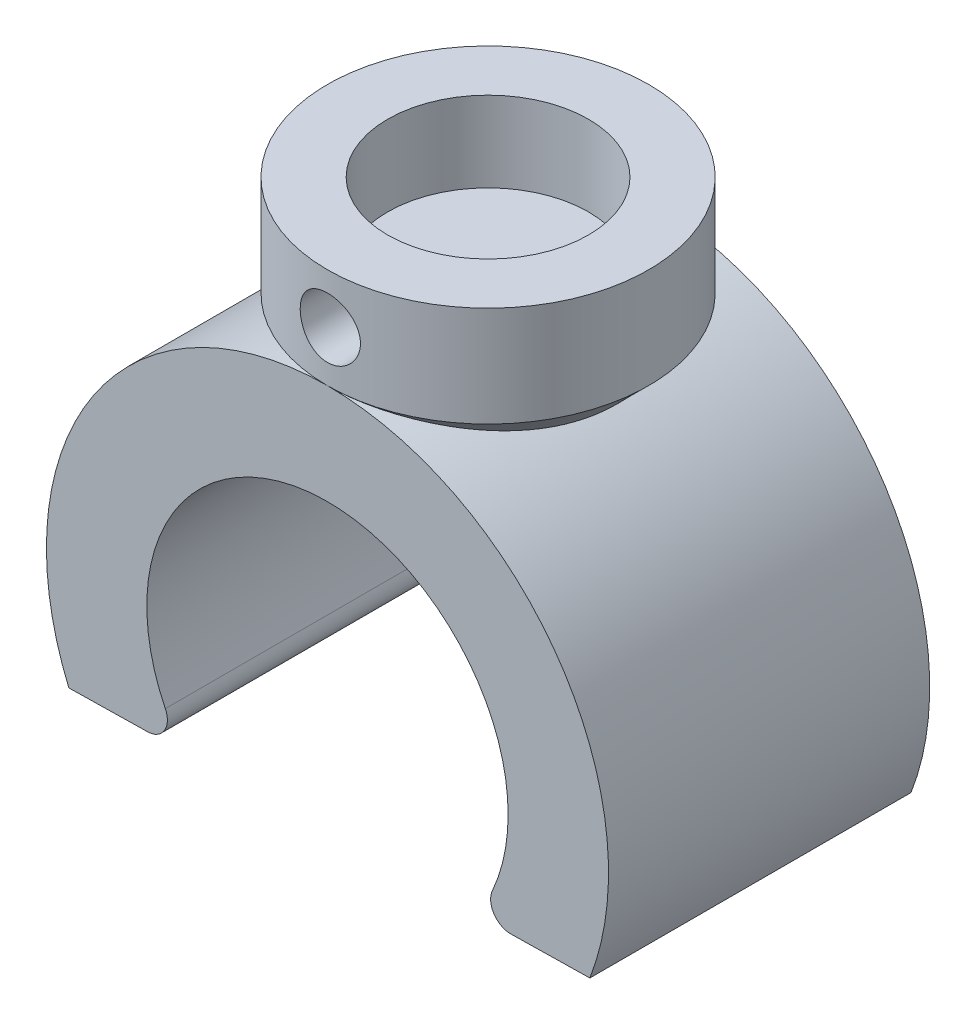
ISO-10303-21;
HEADER;
FILE_DESCRIPTION(('STEP AP214'),'2;1');
FILE_NAME('part.step','',(''),(''),'','','');
FILE_SCHEMA(('AUTOMOTIVE_DESIGN { 1 0 10303 214 1 1 1 1 }'));
ENDSEC;
DATA;
#1=APPLICATION_CONTEXT('core data for automotive mechanical design processes');
#2=APPLICATION_PROTOCOL_DEFINITION('international standard','automotive_design',2000,#1);
#3=PRODUCT_CONTEXT('',#1,'mechanical');
#4=PRODUCT('Part','Part','',(#3));
#5=PRODUCT_RELATED_PRODUCT_CATEGORY('part','',(#4));
#6=PRODUCT_DEFINITION_FORMATION('','',#4);
#7=PRODUCT_DEFINITION_CONTEXT('part definition',#1,'design');
#8=PRODUCT_DEFINITION('design','',#6,#7);
#9=PRODUCT_DEFINITION_SHAPE('','',#8);
#10=(LENGTH_UNIT() NAMED_UNIT(*) SI_UNIT(.MILLI.,.METRE.));
#11=(NAMED_UNIT(*) PLANE_ANGLE_UNIT() SI_UNIT($,.RADIAN.));
#12=(NAMED_UNIT(*) SI_UNIT($,.STERADIAN.) SOLID_ANGLE_UNIT());
#13=UNCERTAINTY_MEASURE_WITH_UNIT(LENGTH_MEASURE(1.E-05),#10,'distance_accuracy_value','');
#14=(GEOMETRIC_REPRESENTATION_CONTEXT(3) GLOBAL_UNCERTAINTY_ASSIGNED_CONTEXT((#13)) GLOBAL_UNIT_ASSIGNED_CONTEXT((#10,
#11,#12)) REPRESENTATION_CONTEXT('',''));
#15=CARTESIAN_POINT('',(0.,0.,0.));
#16=DIRECTION('',(0.,0.,1.));
#17=DIRECTION('',(1.,0.,0.));
#18=AXIS2_PLACEMENT_3D('',#15,#16,#17);
#19=CARTESIAN_POINT('',(0.,0.,16.));
#20=DIRECTION('',(0.,0.,-1.));
#21=DIRECTION('',(-1.,0.,0.));
#22=AXIS2_PLACEMENT_3D('',#19,#20,#21);
#23=CYLINDRICAL_SURFACE('',#22,14.);
#24=CARTESIAN_POINT('',(-4.7847289351422,13.1569893599263,2.67751320195993));
#25=CARTESIAN_POINT('',(-4.92259165947104,13.1068530386451,2.86886324955227));
#26=CARTESIAN_POINT('',(-5.05185351081549,13.0573980846638,3.06652576180412));
#27=CARTESIAN_POINT('',(-5.29325539066796,12.9614166811305,3.47271902235973));
#28=CARTESIAN_POINT('',(-5.40539525214689,12.9148902601498,3.68124987666014));
#29=CARTESIAN_POINT('',(-5.61269810575007,12.8261590347082,4.10790031171428));
#30=CARTESIAN_POINT('',(-5.70783230863332,12.7839616093895,4.32603538817819));
#31=CARTESIAN_POINT('',(-5.88077294083157,12.7053347397049,4.76995531401373));
#32=CARTESIAN_POINT('',(-5.95858724184352,12.6689026772325,4.99573663427666));
#33=CARTESIAN_POINT('',(-6.09736708029159,12.602701266065,5.45544004321236));
#34=CARTESIAN_POINT('',(-6.15818892320618,12.5729891224576,5.68941377863226));
#35=CARTESIAN_POINT('',(-6.26194927420481,12.5216351456844,6.16217063456431));
#36=CARTESIAN_POINT('',(-6.30488749797296,12.4999934408239,6.40095383147457));
#37=CARTESIAN_POINT('',(-6.37268141039293,12.4655677699288,6.88150607973016));
#38=CARTESIAN_POINT('',(-6.39755203790134,12.4527764865046,7.12327249584138));
#39=CARTESIAN_POINT('',(-6.42915159136247,12.4364917633029,7.60829933411208));
#40=CARTESIAN_POINT('',(-6.43588064691723,12.4329982571028,7.85155974558612));
#41=CARTESIAN_POINT('',(-6.43113677343741,12.4354528957646,8.34054689958434));
#42=CARTESIAN_POINT('',(-6.4194618296947,12.441505829153,8.58627118266443));
#43=CARTESIAN_POINT('',(-6.37759142918007,12.4630204240009,9.07572331435848));
#44=CARTESIAN_POINT('',(-6.34739556743153,12.4784822911952,9.31945111919954));
#45=CARTESIAN_POINT('',(-6.26859247386851,12.5182544105472,9.80336983012269));
#46=CARTESIAN_POINT('',(-6.21997107139643,12.5425714724668,10.0435578657714));
#47=CARTESIAN_POINT('',(-6.10450262442174,12.5991736563478,10.5185483530456));
#48=CARTESIAN_POINT('',(-6.03765565886616,12.6314587437944,10.7533508279948));
#49=CARTESIAN_POINT('',(-5.88582043078585,12.7029194396004,11.2162688904585));
#50=CARTESIAN_POINT('',(-5.80080965958057,12.7421035866103,11.4443757781761));
#51=CARTESIAN_POINT('',(-5.6128264570442,12.8260193518759,11.8920314265552));
#52=CARTESIAN_POINT('',(-5.50985253070747,12.8707514317755,12.1115794730343));
#53=CARTESIAN_POINT('',(-5.28606427850298,12.9642670558524,12.54035191995));
#54=CARTESIAN_POINT('',(-5.16526016730844,13.013048273377,12.749582140371));
#55=CARTESIAN_POINT('',(-4.90578484586551,13.1130699293151,13.1560358528358));
#56=CARTESIAN_POINT('',(-4.76711129780538,13.1643106889527,13.3532577688844));
#57=CARTESIAN_POINT('',(-4.38906223357844,13.2964567412004,13.8402938408835));
#58=CARTESIAN_POINT('',(-4.13676331072937,13.3779143774194,14.1201539320842));
#59=CARTESIAN_POINT('',(-3.58914076511522,13.5351011882582,14.6355679205869));
#60=CARTESIAN_POINT('',(-3.29388795790524,13.6108394857096,14.8711933082313));
#61=CARTESIAN_POINT('',(-2.7268814355575,13.7342658316819,15.2436358453642));
#62=CARTESIAN_POINT('',(-2.46257671406343,13.7845254982972,15.3908028130744));
#63=CARTESIAN_POINT('',(-2.04984149654366,13.8498245841676,15.5789412292753));
#64=CARTESIAN_POINT('',(-1.9095153252705,13.869912729414,15.6362282814999));
#65=CARTESIAN_POINT('',(-1.62416204825765,13.9062123468784,15.739052095421));
#66=CARTESIAN_POINT('',(-1.47913705253355,13.9224255324905,15.7845940511635));
#67=CARTESIAN_POINT('',(-1.18419058971041,13.9506203570454,15.8634177414429));
#68=CARTESIAN_POINT('',(-1.0342403227305,13.9625689606884,15.8966038440296));
#69=CARTESIAN_POINT('',(-0.731747106327781,13.9816842662799,15.9495470884855));
#70=CARTESIAN_POINT('',(-0.579205413928908,13.9888532223994,15.9693105608002));
#71=CARTESIAN_POINT('',(-0.272827292653325,13.9981802092336,15.995002084047));
#72=CARTESIAN_POINT('',(-0.118991060048384,14.0003389863029,16.000932195703));
#73=CARTESIAN_POINT('',(0.188563035163672,13.9995745803608,15.9988301113211));
#74=CARTESIAN_POINT('',(0.342280906973649,13.9966518432995,15.9907991404983));
#75=CARTESIAN_POINT('',(0.63094157274146,13.9864347390928,15.9626391791575));
#76=CARTESIAN_POINT('',(0.766048276237477,13.9796700587843,15.9439753117815));
#77=CARTESIAN_POINT('',(1.03415853597305,13.9623995756942,15.896126950546));
#78=CARTESIAN_POINT('',(1.16716138829269,13.9518925473153,15.8669390100755));
#79=CARTESIAN_POINT('',(1.56163746126822,13.9151280247317,15.7642520422674));
#80=CARTESIAN_POINT('',(1.81882107417943,13.883617814956,15.6756050800217));
#81=CARTESIAN_POINT('',(2.32626963411161,13.8078673193437,15.4584975528957));
#82=CARTESIAN_POINT('',(2.57581442934672,13.763156564469,15.3285488195565));
#83=CARTESIAN_POINT('',(3.05326482736365,13.6651767210728,15.0362322369848));
#84=CARTESIAN_POINT('',(3.28115470002602,13.6119014857997,14.8738410832643));
#85=CARTESIAN_POINT('',(3.81782825438613,13.4734460722521,14.4374103412777));
#86=CARTESIAN_POINT('',(4.11276722210828,13.385249597539,14.14724844373));
#87=CARTESIAN_POINT('',(4.65037987205212,13.2081190110496,13.5220986518884));
#88=CARTESIAN_POINT('',(4.8929630389335,13.119183893526,13.1870347238338));
#89=CARTESIAN_POINT('',(5.32893943645344,12.9482808849743,12.4776592448569));
#90=CARTESIAN_POINT('',(5.52154610802826,12.8664365114327,12.1028374095771));
#91=CARTESIAN_POINT('',(5.85254670912225,12.7193019476367,11.3269877736449));
#92=CARTESIAN_POINT('',(5.99095731860296,12.6540066662418,10.9259680803331));
#93=CARTESIAN_POINT('',(6.16566456130889,12.569385487839,10.2804109036507));
#94=CARTESIAN_POINT('',(6.22036898602124,12.5423105616657,10.0416862318104));
#95=CARTESIAN_POINT('',(6.31141804974414,12.496745205302,9.55988133997942));
#96=CARTESIAN_POINT('',(6.34776114557655,12.4782554966669,9.3168007556731));
#97=CARTESIAN_POINT('',(6.4019036464684,12.4505641242054,8.82805925855365));
#98=CARTESIAN_POINT('',(6.41970240703977,12.4413627831863,8.5823982563606));
#99=CARTESIAN_POINT('',(6.43666888003923,12.4325938247441,8.09026516040992));
#100=CARTESIAN_POINT('',(6.43583717617039,12.4330259055004,7.84379309230536));
#101=CARTESIAN_POINT('',(6.41558452543127,12.4434883252134,7.3527271266954));
#102=CARTESIAN_POINT('',(6.39623173208454,12.4534834741532,7.10812965631399));
#103=CARTESIAN_POINT('',(6.33913201530562,12.4826451392692,6.6216426624032));
#104=CARTESIAN_POINT('',(6.30138477456009,12.5018118136587,6.3797531856617));
#105=CARTESIAN_POINT('',(6.2076257039153,12.5486304348126,5.90020652315192));
#106=CARTESIAN_POINT('',(6.15160141979782,12.5762881667358,5.66255234015379));
#107=CARTESIAN_POINT('',(6.0214822657803,12.6391046238714,5.19326257433981));
#108=CARTESIAN_POINT('',(5.94738743768499,12.6742633317308,4.96162697760182));
#109=CARTESIAN_POINT('',(5.78077767505935,12.7511205073113,4.50453214847836));
#110=CARTESIAN_POINT('',(5.68815186759637,12.7928580014019,4.27911986383665));
#111=CARTESIAN_POINT('',(5.48487282880639,12.8813220075977,3.83756116157749));
#112=CARTESIAN_POINT('',(5.37421780499984,12.928049015605,3.62141566797375));
#113=CARTESIAN_POINT('',(5.13500241864705,13.0249140196015,3.20026924691086));
#114=CARTESIAN_POINT('',(5.00645623231068,13.0750492990849,2.99525967288779));
#115=CARTESIAN_POINT('',(4.73139572297959,13.1770789821902,2.59813666174687));
#116=CARTESIAN_POINT('',(4.58487981644793,13.2289735405521,2.40602436348098));
#117=CARTESIAN_POINT('',(4.19520032764785,13.3589387089485,1.94358892962938));
#118=CARTESIAN_POINT('',(3.9405735802295,13.4370047102009,1.68271465937534));
#119=CARTESIAN_POINT('',(3.39139168846223,13.5859907928709,1.20497510506509));
#120=CARTESIAN_POINT('',(3.09690253711167,13.6569223541485,0.988038532570483));
#121=CARTESIAN_POINT('',(2.53100770787274,13.7717217164918,0.646218573530171));
#122=CARTESIAN_POINT('',(2.26605496633071,13.8181708753062,0.51165533934557));
#123=CARTESIAN_POINT('',(1.85391916094008,13.8774041605359,0.342440582884959));
#124=CARTESIAN_POINT('',(1.7140545651685,13.8954115416271,0.291465805771054));
#125=CARTESIAN_POINT('',(1.43019349731651,13.9274873755641,0.201186442561462));
#126=CARTESIAN_POINT('',(1.28619884122977,13.9415575312061,0.161876811003805));
#127=CARTESIAN_POINT('',(0.994058195127138,13.965438524148,0.0954121013401816));
#128=CARTESIAN_POINT('',(0.845890901241483,13.9752202846589,0.0683399603284373));
#129=CARTESIAN_POINT('',(0.547580657929964,13.9900838799555,0.0272840982113621));
#130=CARTESIAN_POINT('',(0.39743862290042,13.9951678173765,0.0132945216235931));
#131=CARTESIAN_POINT('',(0.0964145945117172,14.0004766476435,-0.00131350007402115));
#132=CARTESIAN_POINT('',(-0.0544673658598009,14.0007017551729,-0.00193253595035952));
#133=CARTESIAN_POINT('',(-0.355574121610451,13.9962956904646,0.0101911282944102));
#134=CARTESIAN_POINT('',(-0.505798960823411,13.9916648472652,0.0229329230881699));
#135=CARTESIAN_POINT('',(-0.924014257307386,13.9720560767113,0.0770557594423606));
#136=CARTESIAN_POINT('',(-1.18998874651083,13.9517621991407,0.133199131379633));
#137=CARTESIAN_POINT('',(-1.70888414272118,13.8977716596218,0.284623240544964));
#138=CARTESIAN_POINT('',(-1.96180110849526,13.8640709774279,0.379915717541603));
#139=CARTESIAN_POINT('',(-2.46465697068392,13.783834658354,0.611297915225636));
#140=CARTESIAN_POINT('',(-2.71352348482636,13.7366547044465,0.749477532676426));
#141=CARTESIAN_POINT('',(-3.18849644047476,13.6342451867693,1.05789324281703));
#142=CARTESIAN_POINT('',(-3.41459825343029,13.5790139915755,1.22813583447774));
#143=CARTESIAN_POINT('',(-3.84643666825482,13.4631269621085,1.59827696300887));
#144=CARTESIAN_POINT('',(-4.05175244545106,13.4023937075272,1.7986383007686));
#145=CARTESIAN_POINT('',(-4.43719327525351,13.2797688850922,2.22205875696331));
#146=CARTESIAN_POINT('',(-4.61730361438475,13.2178766644022,2.44513100255782));
#147=CARTESIAN_POINT('',(-4.7847289351422,13.1569893599263,2.67751320195993));
#148=B_SPLINE_CURVE_WITH_KNOTS('',3,(#24,#25,#26,#27,#28,#29,#30,#31,#32,#33,#34,#35,#36,#37,
#38,#39,#40,#41,#42,#43,#44,#45,#46,#47,#48,#49,#50,#51,#52,#53,#54,#55,#56,#57,#58,#59,#60,#61,
#62,#63,#64,#65,#66,#67,#68,#69,#70,#71,#72,#73,#74,#75,#76,#77,#78,#79,#80,#81,#82,#83,#84,#85,
#86,#87,#88,#89,#90,#91,#92,#93,#94,#95,#96,#97,#98,#99,#100,#101,#102,#103,#104,#105,#106,#107,
#108,#109,#110,#111,#112,#113,#114,#115,#116,#117,#118,#119,#120,#121,#122,#123,#124,#125,#126,
#127,#128,#129,#130,#131,#132,#133,#134,#135,#136,#137,#138,#139,#140,#141,#142,#143,#144,#145,
#146,#147),.UNSPECIFIED.,.T.,.F.,(4,2,2,2,2,2,2,2,2,2,2,2,2,2,2,2,2,2,2,2,2,2,2,2,2,2,2,2,2,2,2,
2,2,2,2,2,2,2,2,2,2,2,2,2,2,2,2,2,2,2,2,2,2,2,2,2,2,2,2,2,2,4),(0.,0.723035728560901,
1.44607851005655,2.17033398666743,2.8942596222678,3.62413352640823,4.35401903372796,
5.08330035975454,5.81257647583574,6.54991352292005,7.28726669312072,8.0251880992677,
8.76310630903703,9.50194430996828,10.2408438309624,10.9793216776872,11.7178962358143,
12.8698244518007,14.0198746317432,14.9358423064989,15.3940406323883,15.8520359799573,
16.3135058602777,16.7747579485349,17.2359413207436,17.6970842218647,18.1062671724231,
18.5155842514072,19.3334943500312,20.1850601062277,21.0372397847446,22.2995014425366,
23.5639281845574,24.8471898003567,26.1300561547725,26.8685155022146,27.6070369031622,
28.3455839697555,29.0841078972801,29.8199246271926,30.5557540507589,31.2920859291629,
32.0284161041387,32.7692911854457,33.5102399701604,34.2506049654113,34.991035250428,
36.1050751193326,37.2172927296661,38.1156076021316,38.5649780059257,39.0141537617382,
39.4663296781482,39.918303113068,40.3702565778675,40.8221794203649,41.6359520101452,
42.4499688068684,43.3124146278064,44.1750354498007,45.0526052048271,45.9306851162951),.UNSPECIFIED.);
#149=CARTESIAN_POINT('',(0.,14.,16.));
#150=VERTEX_POINT('',#149);
#151=CARTESIAN_POINT('',(0.,14.,0.));
#152=VERTEX_POINT('',#151);
#153=EDGE_CURVE('E122',#150,#152,#148,.T.);
#154=ORIENTED_EDGE('',*,*,#153,.F.);
#155=CARTESIAN_POINT('',(0.,0.,16.));
#156=DIRECTION('',(0.,0.,1.));
#157=DIRECTION('',(1.,0.,0.));
#158=AXIS2_PLACEMENT_3D('',#155,#156,#157);
#159=CIRCLE('',#158,14.);
#160=CARTESIAN_POINT('',(13.0703371486462,-5.0166011223456,16.));
#161=VERTEX_POINT('',#160);
#162=EDGE_CURVE('E415',#161,#150,#159,.T.);
#163=ORIENTED_EDGE('',*,*,#162,.F.);
#164=DIRECTION('',(0.,0.,-1.));
#165=VECTOR('',#164,1.);
#166=CARTESIAN_POINT('',(13.0703371486462,-5.0166011223456,16.));
#167=LINE('',#166,#165);
#168=CARTESIAN_POINT('',(13.0703371486462,-5.0166011223456,0.));
#169=VERTEX_POINT('',#168);
#170=EDGE_CURVE('E134',#161,#169,#167,.T.);
#171=ORIENTED_EDGE('',*,*,#170,.T.);
#172=CARTESIAN_POINT('',(0.,0.,0.));
#173=DIRECTION('',(0.,0.,1.));
#174=DIRECTION('',(1.,0.,0.));
#175=AXIS2_PLACEMENT_3D('',#172,#173,#174);
#176=CIRCLE('',#175,14.);
#177=EDGE_CURVE('E132',#169,#152,#176,.T.);
#178=ORIENTED_EDGE('',*,*,#177,.T.);
#179=EDGE_LOOP('',(#154,#163,#171,#178));
#180=FACE_BOUND('',#179,.T.);
#181=ADVANCED_FACE('F45',(#180),#23,.T.);
#182=EDGE_CURVE('E112',#152,#150,#148,.T.);
#183=ORIENTED_EDGE('',*,*,#182,.F.);
#184=CARTESIAN_POINT('',(-12.8828969191276,-5.48005173069871,0.));
#185=VERTEX_POINT('',#184);
#186=EDGE_CURVE('E137',#152,#185,#176,.T.);
#187=ORIENTED_EDGE('',*,*,#186,.T.);
#188=DIRECTION('',(0.,0.,-1.));
#189=VECTOR('',#188,1.);
#190=CARTESIAN_POINT('',(-12.8828969191276,-5.48005173069871,16.));
#191=LINE('',#190,#189);
#192=CARTESIAN_POINT('',(-12.8828969191276,-5.48005173069871,16.));
#193=VERTEX_POINT('',#192);
#194=EDGE_CURVE('E408',#185,#193,#191,.F.);
#195=ORIENTED_EDGE('',*,*,#194,.T.);
#196=EDGE_CURVE('E136',#150,#193,#159,.T.);
#197=ORIENTED_EDGE('',*,*,#196,.F.);
#198=EDGE_LOOP('',(#183,#187,#195,#197));
#199=FACE_BOUND('',#198,.T.);
#200=ADVANCED_FACE('F148',(#199),#23,.T.);
#201=CARTESIAN_POINT('',(0.,0.,16.));
#202=DIRECTION('',(0.,0.,1.));
#203=DIRECTION('',(1.,0.,0.));
#204=AXIS2_PLACEMENT_3D('',#201,#202,#203);
#205=PLANE('',#204);
#206=CARTESIAN_POINT('',(0.,0.,16.));
#207=DIRECTION('',(0.,0.,1.));
#208=DIRECTION('',(1.,0.,0.));
#209=AXIS2_PLACEMENT_3D('',#206,#207,#208);
#210=CIRCLE('',#209,9.);
#211=CARTESIAN_POINT('',(8.21407430972492,-3.6781766181516,16.));
#212=VERTEX_POINT('',#211);
#213=CARTESIAN_POINT('',(-8.07751583670852,-3.96909787076648,16.));
#214=VERTEX_POINT('',#213);
#215=EDGE_CURVE('E400',#212,#214,#210,.T.);
#216=ORIENTED_EDGE('',*,*,#215,.F.);
#217=CARTESIAN_POINT('',(9.12674923302768,-4.08686290905733,16.));
#218=DIRECTION('',(0.,0.,1.));
#219=DIRECTION('',(1.,0.,0.));
#220=AXIS2_PLACEMENT_3D('',#217,#218,#219);
#221=CIRCLE('',#220,1.);
#222=CARTESIAN_POINT('',(9.14460352944456,-5.08670350840278,16.));
#223=VERTEX_POINT('',#222);
#224=EDGE_CURVE('E381',#212,#223,#221,.T.);
#225=ORIENTED_EDGE('',*,*,#224,.T.);
#226=DIRECTION('',(-0.999840599345445,-0.0178542964168829,0.));
#227=VECTOR('',#226,1.);
#228=CARTESIAN_POINT('',(-14.,-5.5,16.));
#229=LINE('',#228,#227);
#230=EDGE_CURVE('E403',#161,#223,#229,.T.);
#231=ORIENTED_EDGE('',*,*,#230,.F.);
#232=ORIENTED_EDGE('',*,*,#162,.T.);
#233=ORIENTED_EDGE('',*,*,#196,.T.);
#234=CARTESIAN_POINT('',(-8.95716329992592,-5.40994934464153,16.));
#235=VERTEX_POINT('',#234);
#236=EDGE_CURVE('E128',#235,#193,#229,.T.);
#237=ORIENTED_EDGE('',*,*,#236,.F.);
#238=CARTESIAN_POINT('',(-8.9750175963428,-4.41010874529609,16.));
#239=DIRECTION('',(0.,0.,1.));
#240=DIRECTION('',(1.,0.,0.));
#241=AXIS2_PLACEMENT_3D('',#238,#239,#240);
#242=CIRCLE('',#241,1.);
#243=EDGE_CURVE('E374',#235,#214,#242,.T.);
#244=ORIENTED_EDGE('',*,*,#243,.T.);
#245=EDGE_LOOP('',(#216,#225,#231,#232,#233,#237,#244));
#246=FACE_BOUND('',#245,.T.);
#247=ADVANCED_FACE('F178',(#246),#205,.T.);
#248=CARTESIAN_POINT('',(0.,0.,0.));
#249=DIRECTION('',(0.,0.,1.));
#250=DIRECTION('',(1.,0.,0.));
#251=AXIS2_PLACEMENT_3D('',#248,#249,#250);
#252=PLANE('',#251);
#253=DIRECTION('',(-0.999840599345445,-0.0178542964168829,0.));
#254=VECTOR('',#253,1.);
#255=CARTESIAN_POINT('',(-14.,-5.5,0.));
#256=LINE('',#255,#254);
#257=CARTESIAN_POINT('',(9.14460352944456,-5.08670350840278,0.));
#258=VERTEX_POINT('',#257);
#259=EDGE_CURVE('E397',#169,#258,#256,.T.);
#260=ORIENTED_EDGE('',*,*,#259,.T.);
#261=CARTESIAN_POINT('',(9.12674923302768,-4.08686290905733,0.));
#262=DIRECTION('',(0.,0.,1.));
#263=DIRECTION('',(1.,0.,0.));
#264=AXIS2_PLACEMENT_3D('',#261,#262,#263);
#265=CIRCLE('',#264,1.);
#266=CARTESIAN_POINT('',(8.21407430972492,-3.6781766181516,0.));
#267=VERTEX_POINT('',#266);
#268=EDGE_CURVE('E54',#258,#267,#265,.F.);
#269=ORIENTED_EDGE('',*,*,#268,.T.);
#270=CARTESIAN_POINT('',(0.,0.,0.));
#271=DIRECTION('',(0.,0.,1.));
#272=DIRECTION('',(1.,0.,0.));
#273=AXIS2_PLACEMENT_3D('',#270,#271,#272);
#274=CIRCLE('',#273,9.);
#275=CARTESIAN_POINT('',(-8.07751583670852,-3.96909787076648,0.));
#276=VERTEX_POINT('',#275);
#277=EDGE_CURVE('E146',#276,#267,#274,.F.);
#278=ORIENTED_EDGE('',*,*,#277,.F.);
#279=CARTESIAN_POINT('',(-8.9750175963428,-4.41010874529609,0.));
#280=DIRECTION('',(0.,0.,1.));
#281=DIRECTION('',(1.,0.,0.));
#282=AXIS2_PLACEMENT_3D('',#279,#280,#281);
#283=CIRCLE('',#282,1.);
#284=CARTESIAN_POINT('',(-8.95716329992592,-5.40994934464153,0.));
#285=VERTEX_POINT('',#284);
#286=EDGE_CURVE('E61',#276,#285,#283,.F.);
#287=ORIENTED_EDGE('',*,*,#286,.T.);
#288=EDGE_CURVE('E141',#285,#185,#256,.T.);
#289=ORIENTED_EDGE('',*,*,#288,.T.);
#290=ORIENTED_EDGE('',*,*,#186,.F.);
#291=ORIENTED_EDGE('',*,*,#177,.F.);
#292=EDGE_LOOP('',(#260,#269,#278,#287,#289,#290,#291));
#293=FACE_BOUND('',#292,.T.);
#294=ADVANCED_FACE('F140',(#293),#252,.F.);
#295=CARTESIAN_POINT('',(0.,0.,-0.001000000000001));
#296=DIRECTION('',(0.,0.,1.));
#297=DIRECTION('',(1.,0.,0.));
#298=AXIS2_PLACEMENT_3D('',#295,#296,#297);
#299=CYLINDRICAL_SURFACE('',#298,9.);
#300=ORIENTED_EDGE('',*,*,#277,.T.);
#301=DIRECTION('',(0.,0.,1.));
#302=VECTOR('',#301,1.);
#303=CARTESIAN_POINT('',(8.21407430972492,-3.6781766181516,-0.001000000000001));
#304=LINE('',#303,#302);
#305=EDGE_CURVE('E382',#267,#212,#304,.T.);
#306=ORIENTED_EDGE('',*,*,#305,.T.);
#307=ORIENTED_EDGE('',*,*,#215,.T.);
#308=DIRECTION('',(0.,0.,1.));
#309=VECTOR('',#308,1.);
#310=CARTESIAN_POINT('',(-8.07751583670852,-3.96909787076648,-0.001000000000001));
#311=LINE('',#310,#309);
#312=EDGE_CURVE('E376',#214,#276,#311,.F.);
#313=ORIENTED_EDGE('',*,*,#312,.T.);
#314=EDGE_LOOP('',(#300,#306,#307,#313));
#315=FACE_BOUND('',#314,.T.);
#316=ADVANCED_FACE('F174',(#315),#299,.F.);
#317=CARTESIAN_POINT('',(-14.,-5.5,0.));
#318=DIRECTION('',(-0.0178542964168829,0.999840599345445,0.));
#319=DIRECTION('',(-0.999840599345445,-0.0178542964168829,0.));
#320=AXIS2_PLACEMENT_3D('',#317,#318,#319);
#321=PLANE('',#320);
#322=ORIENTED_EDGE('',*,*,#230,.T.);
#323=DIRECTION('',(0.,0.,1.));
#324=VECTOR('',#323,1.);
#325=CARTESIAN_POINT('',(9.14460352944457,-5.08670350840277,0.));
#326=LINE('',#325,#324);
#327=EDGE_CURVE('E69',#223,#258,#326,.F.);
#328=ORIENTED_EDGE('',*,*,#327,.T.);
#329=ORIENTED_EDGE('',*,*,#259,.F.);
#330=ORIENTED_EDGE('',*,*,#170,.F.);
#331=EDGE_LOOP('',(#322,#328,#329,#330));
#332=FACE_BOUND('',#331,.T.);
#333=ADVANCED_FACE('F171',(#332),#321,.F.);
#334=ORIENTED_EDGE('',*,*,#288,.F.);
#335=DIRECTION('',(0.,0.,1.));
#336=VECTOR('',#335,1.);
#337=CARTESIAN_POINT('',(-8.95716329992592,-5.40994934464153,0.));
#338=LINE('',#337,#336);
#339=EDGE_CURVE('E11',#285,#235,#338,.T.);
#340=ORIENTED_EDGE('',*,*,#339,.T.);
#341=ORIENTED_EDGE('',*,*,#236,.T.);
#342=ORIENTED_EDGE('',*,*,#194,.F.);
#343=EDGE_LOOP('',(#334,#340,#341,#342));
#344=FACE_BOUND('',#343,.T.);
#345=ADVANCED_FACE('F168',(#344),#321,.F.);
#346=CARTESIAN_POINT('',(0.,11.,8.));
#347=DIRECTION('',(0.,1.,0.));
#348=DIRECTION('',(0.,0.,1.));
#349=AXIS2_PLACEMENT_3D('',#346,#347,#348);
#350=CONICAL_SURFACE('',#349,5.,0.78539816339745);
#351=CARTESIAN_POINT('',(0.,14.,8.));
#352=DIRECTION('',(0.,1.,0.));
#353=DIRECTION('',(0.,0.,1.));
#354=AXIS2_PLACEMENT_3D('',#351,#352,#353);
#355=CIRCLE('',#354,8.00000000000001);
#356=EDGE_CURVE('E117',#150,#152,#355,.T.);
#357=ORIENTED_EDGE('',*,*,#356,.F.);
#358=ORIENTED_EDGE('',*,*,#153,.T.);
#359=EDGE_LOOP('',(#357,#358));
#360=FACE_BOUND('',#359,.T.);
#361=ADVANCED_FACE('F124',(#360),#350,.T.);
#362=EDGE_CURVE('E108',#152,#150,#355,.T.);
#363=ORIENTED_EDGE('',*,*,#362,.F.);
#364=ORIENTED_EDGE('',*,*,#182,.T.);
#365=EDGE_LOOP('',(#363,#364));
#366=FACE_BOUND('',#365,.T.);
#367=ADVANCED_FACE('F110',(#366),#350,.T.);
#368=CARTESIAN_POINT('',(0.,19.,8.));
#369=DIRECTION('',(0.,-1.,0.));
#370=DIRECTION('',(0.,0.,-1.));
#371=AXIS2_PLACEMENT_3D('',#368,#369,#370);
#372=CYLINDRICAL_SURFACE('',#371,8.);
#373=CARTESIAN_POINT('',(1.5,16.5,15.8581168227509));
#374=CARTESIAN_POINT('',(1.49999679883246,16.4165427919883,15.8581184379349));
#375=CARTESIAN_POINT('',(1.49301126348936,16.3330440517816,15.8594607976027));
#376=CARTESIAN_POINT('',(1.46527253251805,16.1684010384181,15.8646785101436));
#377=CARTESIAN_POINT('',(1.44450765768477,16.0872588235725,15.8685560117321));
#378=CARTESIAN_POINT('',(1.38987035617788,15.9297349286291,15.8783897646488));
#379=CARTESIAN_POINT('',(1.35601013954374,15.8533488906927,15.88434407906));
#380=CARTESIAN_POINT('',(1.27617565760366,15.7073464407132,15.8976582632096));
#381=CARTESIAN_POINT('',(1.23020233759193,15.6377295009967,15.9050180232562));
#382=CARTESIAN_POINT('',(1.12683678942622,15.5063698008009,15.9204161483894));
#383=CARTESIAN_POINT('',(1.06932292933092,15.4447235165283,15.9284611662568));
#384=CARTESIAN_POINT('',(0.944771778803553,15.3318956104004,15.9442645766403));
#385=CARTESIAN_POINT('',(0.877733863624947,15.2807146755752,15.9520229503115));
#386=CARTESIAN_POINT('',(0.735403894570165,15.1899006233995,15.9664501782841));
#387=CARTESIAN_POINT('',(0.660052840033867,15.1503584664806,15.9731102805236));
#388=CARTESIAN_POINT('',(0.503631283250763,15.0845304577265,15.9845160863293));
#389=CARTESIAN_POINT('',(0.422561251859507,15.0582435160098,15.9892619472833));
#390=CARTESIAN_POINT('',(0.258002746187417,15.0199704513889,15.9962575512378));
#391=CARTESIAN_POINT('',(0.174553323244858,15.0078216940773,15.9985356597633));
#392=CARTESIAN_POINT('',(0.00677167603538375,14.9976631122996,16.0004368461559));
#393=CARTESIAN_POINT('',(-0.0775604724476695,14.9996520838609,16.000060150107));
#394=CARTESIAN_POINT('',(-0.243598357899396,15.0175877711472,15.9967163376324));
#395=CARTESIAN_POINT('',(-0.325323760451468,15.03335936943,15.9937817224721));
#396=CARTESIAN_POINT('',(-0.484947165715475,15.0781356493952,15.9856882633356));
#397=CARTESIAN_POINT('',(-0.56284502882654,15.1071408133458,15.9805293382997));
#398=CARTESIAN_POINT('',(-0.713110065751521,15.1777277310583,15.9685126029734));
#399=CARTESIAN_POINT('',(-0.785443571838532,15.2193794879125,15.9616453759083));
#400=CARTESIAN_POINT('',(-0.922159977214637,15.3140256690772,15.9469714754285));
#401=CARTESIAN_POINT('',(-0.986542066910784,15.3670212468876,15.9391647065116));
#402=CARTESIAN_POINT('',(-1.10656561896904,15.4838157029835,15.9233351368057));
#403=CARTESIAN_POINT('',(-1.16205790757041,15.5477677839021,15.9153108590162));
#404=CARTESIAN_POINT('',(-1.2615517185126,15.6841495312786,15.9000650892462));
#405=CARTESIAN_POINT('',(-1.30555307271182,15.7565793217646,15.8928436090135));
#406=CARTESIAN_POINT('',(-1.38085852224478,15.9080582707027,15.8800189330712));
#407=CARTESIAN_POINT('',(-1.41214093645421,15.9871184571906,15.8744185053026));
#408=CARTESIAN_POINT('',(-1.46093656975056,16.1495011841232,15.8655124239669));
#409=CARTESIAN_POINT('',(-1.47845134901108,16.2328232404648,15.8622065103862));
#410=CARTESIAN_POINT('',(-1.49899672649739,16.4000193288559,15.8583152030101));
#411=CARTESIAN_POINT('',(-1.50224164285859,16.4838661155655,15.8576895581614));
#412=CARTESIAN_POINT('',(-1.49472968881725,16.6509034550871,15.8591219142084));
#413=CARTESIAN_POINT('',(-1.48397351086433,16.7340940401481,15.8611797823861));
#414=CARTESIAN_POINT('',(-1.44894868195883,16.8967529030544,15.8677098006321));
#415=CARTESIAN_POINT('',(-1.4247923858399,16.9762462526249,15.8721618669088));
#416=CARTESIAN_POINT('',(-1.3637722437906,17.1300571897302,15.8829613415662));
#417=CARTESIAN_POINT('',(-1.32690746128795,17.2043743953153,15.8893088896328));
#418=CARTESIAN_POINT('',(-1.2410235311966,17.3466676190432,15.9032757786369));
#419=CARTESIAN_POINT('',(-1.19186899639621,17.4145605378661,15.9109089542532));
#420=CARTESIAN_POINT('',(-1.08298344344247,17.5412120402143,15.926548113681));
#421=CARTESIAN_POINT('',(-1.02325147433084,17.5999698015558,15.9345541309649));
#422=CARTESIAN_POINT('',(-0.893949417870387,17.7074837635341,15.9501662400595));
#423=CARTESIAN_POINT('',(-0.824258534095891,17.756095826606,15.957765558333));
#424=CARTESIAN_POINT('',(-0.677574523040141,17.8409212061777,15.9715940481035));
#425=CARTESIAN_POINT('',(-0.60058167703853,17.877135000025,15.9778232723472));
#426=CARTESIAN_POINT('',(-0.441877541578686,17.9359200978641,15.9881805799585));
#427=CARTESIAN_POINT('',(-0.360193213078989,17.9585621875614,15.9923195473014));
#428=CARTESIAN_POINT('',(-0.194096227381572,17.9897870482899,15.9980764208375));
#429=CARTESIAN_POINT('',(-0.109683858215852,17.9983712986627,15.9996945922993));
#430=CARTESIAN_POINT('',(0.0580907602505088,18.0011853015184,16.0002222751544));
#431=CARTESIAN_POINT('',(0.141449307066268,17.9956327531295,15.9991728662503));
#432=CARTESIAN_POINT('',(0.306023369279199,17.9708075722316,15.994568666117));
#433=CARTESIAN_POINT('',(0.387238905213689,17.9515350712558,15.9910138989067));
#434=CARTESIAN_POINT('',(0.545106475595484,17.8999087926163,15.9817983797805));
#435=CARTESIAN_POINT('',(0.621766319318223,17.867578187119,15.9761413598158));
#436=CARTESIAN_POINT('',(0.768605631316694,17.7907795463448,15.9633337206877));
#437=CARTESIAN_POINT('',(0.838784665003271,17.7463106978933,15.9561830014648));
#438=CARTESIAN_POINT('',(0.971755027780005,17.6457485455577,15.9410477985994));
#439=CARTESIAN_POINT('',(1.03442623539053,17.5894979661383,15.9330528459127));
#440=CARTESIAN_POINT('',(1.14951536065485,17.4672954375073,15.9171963353883));
#441=CARTESIAN_POINT('',(1.2019308632478,17.4013412096263,15.9093348093676));
#442=CARTESIAN_POINT('',(1.29547633945385,17.2608735452967,15.8945557742593));
#443=CARTESIAN_POINT('',(1.33649740531872,17.1862865603324,15.8876476728073));
#444=CARTESIAN_POINT('',(1.40536132423417,17.0311742100203,15.8756708465003));
#445=CARTESIAN_POINT('',(1.43321661638912,16.9506545334106,15.8706003864912));
#446=CARTESIAN_POINT('',(1.46929726596175,16.8082477119341,15.8639301629212));
#447=CARTESIAN_POINT('',(1.48079105739851,16.7471942762381,15.8617631071793));
#448=CARTESIAN_POINT('',(1.49614351076215,16.6241015315797,15.858855855955));
#449=CARTESIAN_POINT('',(1.50000238052127,16.5620622494997,15.8581156216328));
#450=CARTESIAN_POINT('',(1.5,16.5,15.8581168227509));
#451=B_SPLINE_CURVE_WITH_KNOTS('',3,(#373,#374,#375,#376,#377,#378,#379,#380,#381,#382,#383,
#384,#385,#386,#387,#388,#389,#390,#391,#392,#393,#394,#395,#396,#397,#398,#399,#400,#401,#402,
#403,#404,#405,#406,#407,#408,#409,#410,#411,#412,#413,#414,#415,#416,#417,#418,#419,#420,#421,
#422,#423,#424,#425,#426,#427,#428,#429,#430,#431,#432,#433,#434,#435,#436,#437,#438,#439,#440,
#441,#442,#443,#444,#445,#446,#447,#448,#449,#450),.UNSPECIFIED.,.T.,.F.,(4,2,2,2,2,2,2,2,2,2,2,
2,2,2,2,2,2,2,2,2,2,2,2,2,2,2,2,2,2,2,2,2,2,2,2,2,2,2,4),(0.,0.250144505793185,
0.500501302380392,0.75062522797843,1.00072963993908,1.25362335698691,1.50653367069315,
1.76137104348047,2.0161874593964,2.26804275460261,2.51987660200648,2.76855650598725,
3.01724547328425,3.26733691984219,3.51745380911785,3.77140614764064,4.025362201924,
4.27974936118266,4.53410768866488,4.78463248587076,5.03514489338718,5.28358792315369,
5.53204926624318,5.78337862654144,6.03473059394677,6.28944125495871,6.54414210821705,
6.79750269418683,7.05083661667331,7.30029300570138,7.54974700322168,7.79876026530358,
8.0477902135711,8.30038464008745,8.55303847730765,8.80803001818118,9.0627801574912,
9.24880307527215,9.43482092920426),.UNSPECIFIED.);
#452=CARTESIAN_POINT('',(1.5,16.5,15.8581168227509));
#453=VERTEX_POINT('',#452);
#454=EDGE_CURVE('E340',#453,#453,#451,.T.);
#455=ORIENTED_EDGE('',*,*,#454,.T.);
#456=EDGE_LOOP('',(#455));
#457=FACE_BOUND('',#456,.T.);
#458=CARTESIAN_POINT('',(0.,19.,8.));
#459=DIRECTION('',(0.,1.,0.));
#460=DIRECTION('',(0.,0.,1.));
#461=AXIS2_PLACEMENT_3D('',#458,#459,#460);
#462=CIRCLE('',#461,8.);
#463=CARTESIAN_POINT('',(0.,19.,16.));
#464=VERTEX_POINT('',#463);
#465=EDGE_CURVE('E118',#464,#464,#462,.T.);
#466=ORIENTED_EDGE('',*,*,#465,.F.);
#467=EDGE_LOOP('',(#466));
#468=FACE_BOUND('',#467,.T.);
#469=ORIENTED_EDGE('',*,*,#356,.T.);
#470=ORIENTED_EDGE('',*,*,#362,.T.);
#471=EDGE_LOOP('',(#469,#470));
#472=FACE_BOUND('',#471,.T.);
#473=ADVANCED_FACE('F151',(#457,#468,#472),#372,.T.);
#474=CARTESIAN_POINT('',(0.,19.,8.));
#475=DIRECTION('',(0.,1.,0.));
#476=DIRECTION('',(0.,0.,1.));
#477=AXIS2_PLACEMENT_3D('',#474,#475,#476);
#478=PLANE('',#477);
#479=CARTESIAN_POINT('',(0.,19.,8.));
#480=DIRECTION('',(0.,1.,0.));
#481=DIRECTION('',(0.,0.,1.));
#482=AXIS2_PLACEMENT_3D('',#479,#480,#481);
#483=CIRCLE('',#482,5.);
#484=CARTESIAN_POINT('',(0.,19.,13.));
#485=VERTEX_POINT('',#484);
#486=EDGE_CURVE('E348',#485,#485,#483,.T.);
#487=ORIENTED_EDGE('',*,*,#486,.F.);
#488=EDGE_LOOP('',(#487));
#489=FACE_BOUND('',#488,.T.);
#490=ORIENTED_EDGE('',*,*,#465,.T.);
#491=EDGE_LOOP('',(#490));
#492=FACE_BOUND('',#491,.T.);
#493=ADVANCED_FACE('F277',(#489,#492),#478,.T.);
#494=CARTESIAN_POINT('',(0.,15.,8.));
#495=DIRECTION('',(0.,1.,0.));
#496=DIRECTION('',(0.,0.,1.));
#497=AXIS2_PLACEMENT_3D('',#494,#495,#496);
#498=CYLINDRICAL_SURFACE('',#497,5.);
#499=CARTESIAN_POINT('',(0.,15.,8.));
#500=DIRECTION('',(0.,1.,0.));
#501=DIRECTION('',(0.,0.,1.));
#502=AXIS2_PLACEMENT_3D('',#499,#500,#501);
#503=CIRCLE('',#502,5.);
#504=CARTESIAN_POINT('',(0.,15.,13.));
#505=VERTEX_POINT('',#504);
#506=EDGE_CURVE('E345',#505,#505,#503,.T.);
#507=ORIENTED_EDGE('',*,*,#506,.F.);
#508=CARTESIAN_POINT('',(0.,15.,13.));
#509=CARTESIAN_POINT('',(0.0822886127533,15.0000009974849,12.9999992925055));
#510=CARTESIAN_POINT('',(0.16458731835153,15.006793863624,12.9979491569395));
#511=CARTESIAN_POINT('',(0.326788125304881,15.0337213542221,12.9899710559369));
#512=CARTESIAN_POINT('',(0.40668950441142,15.0538599580233,12.9840419338969));
#513=CARTESIAN_POINT('',(0.561732707754527,15.1067460169103,12.9689555250184));
#514=CARTESIAN_POINT('',(0.636881364395373,15.1394748696189,12.9598030025043));
#515=CARTESIAN_POINT('',(0.780624181053132,15.2165360930558,12.9392210923765));
#516=CARTESIAN_POINT('',(0.84921746746967,15.2608700073954,12.9277914019207));
#517=CARTESIAN_POINT('',(0.979871797183746,15.3612240074727,12.9035073719277));
#518=CARTESIAN_POINT('',(1.04171807124434,15.4175166258859,12.8906238365704));
#519=CARTESIAN_POINT('',(1.15524920923324,15.5396092299102,12.8650583421044));
#520=CARTESIAN_POINT('',(1.20693236327441,15.605410812125,12.852376417245));
#521=CARTESIAN_POINT('',(1.29980037723708,15.7464707530376,12.8283411399377));
#522=CARTESIAN_POINT('',(1.34072309022214,15.8219084609907,12.8170240666387));
#523=CARTESIAN_POINT('',(1.4092139477476,15.9789892542303,12.7974362039403));
#524=CARTESIAN_POINT('',(1.43678529919973,16.060630843928,12.7891646831331));
#525=CARTESIAN_POINT('',(1.47701633682652,16.2253902661305,12.7769087083843));
#526=CARTESIAN_POINT('',(1.49007196234677,16.3084027438639,12.7728106932453));
#527=CARTESIAN_POINT('',(1.50213730614672,16.4755331562168,12.7690278974977));
#528=CARTESIAN_POINT('',(1.50115042761078,16.5596508180591,12.7693420476057));
#529=CARTESIAN_POINT('',(1.48546977199812,16.7233839086085,12.7742474406778));
#530=CARTESIAN_POINT('',(1.47127205262685,16.8030522503622,12.7786838859914));
#531=CARTESIAN_POINT('',(1.43037420427056,16.9588197862735,12.7910835622862));
#532=CARTESIAN_POINT('',(1.40367284141641,17.0349186273743,12.7990471413235));
#533=CARTESIAN_POINT('',(1.33816026653681,17.1826003496607,12.8177273307497));
#534=CARTESIAN_POINT('',(1.29918816934642,17.2541070839553,12.8284801611595));
#535=CARTESIAN_POINT('',(1.21035222588683,17.3897320220102,12.8515098700006));
#536=CARTESIAN_POINT('',(1.16048574002588,17.4538484294138,12.8637871174699));
#537=CARTESIAN_POINT('',(1.04881290765546,17.575686190762,12.8891101129794));
#538=CARTESIAN_POINT('',(0.986594907466973,17.6330286640297,12.902166543105));
#539=CARTESIAN_POINT('',(0.853263259313966,17.7365539840643,12.9271224406326));
#540=CARTESIAN_POINT('',(0.782149051860886,17.7827361284144,12.9390218351841));
#541=CARTESIAN_POINT('',(0.6323550383428,17.8628599224647,12.9604316006947));
#542=CARTESIAN_POINT('',(0.553627749747948,17.8967175162499,12.9699254366831));
#543=CARTESIAN_POINT('',(0.391245415603518,17.9505995900996,12.9853352183222));
#544=CARTESIAN_POINT('',(0.307591751589581,17.9706279285325,12.99125216187));
#545=CARTESIAN_POINT('',(0.140952242668332,17.9956521778994,12.9986836464354));
#546=CARTESIAN_POINT('',(0.0580500976011874,18.0011615858016,13.0003485041779));
#547=CARTESIAN_POINT('',(-0.107499605823383,17.9984308442879,12.9995292324176));
#548=CARTESIAN_POINT('',(-0.190147196690781,17.9901925303486,12.9970456567776));
#549=CARTESIAN_POINT('',(-0.350903605309697,17.9606153888885,12.9883069698716));
#550=CARTESIAN_POINT('',(-0.429072772614169,17.9395766124191,12.9821382979942));
#551=CARTESIAN_POINT('',(-0.580754638954522,17.8853567672218,12.9667434784153));
#552=CARTESIAN_POINT('',(-0.654266777025585,17.8521742389621,12.9575169632108));
#553=CARTESIAN_POINT('',(-0.796437189461054,17.7737468345189,12.9366965435132));
#554=CARTESIAN_POINT('',(-0.864943826199672,17.728240659052,12.9250528082967));
#555=CARTESIAN_POINT('',(-0.993523307980149,17.6267752459472,12.9007346876432));
#556=CARTESIAN_POINT('',(-1.05359403235594,17.5708133881123,12.8880600443108));
#557=CARTESIAN_POINT('',(-1.16585744551027,17.4476126916307,12.8625317186914));
#558=CARTESIAN_POINT('',(-1.21768481231503,17.3800381242283,12.8496882503327));
#559=CARTESIAN_POINT('',(-1.30928995072153,17.2368720609865,12.8257651523846));
#560=CARTESIAN_POINT('',(-1.34906803829472,17.1612807754418,12.8146854765465));
#561=CARTESIAN_POINT('',(-1.41517347127168,17.0044675087453,12.7956718961506));
#562=CARTESIAN_POINT('',(-1.4415634693705,16.9232738134634,12.7877233784383));
#563=CARTESIAN_POINT('',(-1.48021730815114,16.7573120310685,12.7759159436279));
#564=CARTESIAN_POINT('',(-1.49248598978779,16.6725451792123,12.772055625083));
#565=CARTESIAN_POINT('',(-1.50221984485059,16.5056384816238,12.7689997249609));
#566=CARTESIAN_POINT('',(-1.5002805530849,16.4235363489824,12.7696164744275));
#567=CARTESIAN_POINT('',(-1.48307505444813,16.2608858966272,12.7749940128829));
#568=CARTESIAN_POINT('',(-1.46780938124716,16.1803375148236,12.7797546359255));
#569=CARTESIAN_POINT('',(-1.42476888804136,16.0240546008571,12.7927576367039));
#570=CARTESIAN_POINT('',(-1.39715175507068,15.9482727126383,12.8009560454596));
#571=CARTESIAN_POINT('',(-1.33031507121129,15.8023575611823,12.8199027890914));
#572=CARTESIAN_POINT('',(-1.29109329962876,15.7322253823592,12.8306516119431));
#573=CARTESIAN_POINT('',(-1.20048763805072,15.5968368834729,12.8539767642583));
#574=CARTESIAN_POINT('',(-1.14871276092994,15.5318512387396,12.866605401638));
#575=CARTESIAN_POINT('',(-1.03517434629782,15.4112975016921,12.8920132045003));
#576=CARTESIAN_POINT('',(-0.973408217134502,15.3557318605322,12.9047924082391));
#577=CARTESIAN_POINT('',(-0.839465762183248,15.253976587705,12.9295093657065));
#578=CARTESIAN_POINT('',(-0.767037885790607,15.2081085531445,12.9414115976567));
#579=CARTESIAN_POINT('',(-0.615141373983529,15.129264830096,12.9626068045581));
#580=CARTESIAN_POINT('',(-0.535676052998955,15.0962831117255,12.9719009993107));
#581=CARTESIAN_POINT('',(-0.380757712655281,15.0471047243473,12.986021749693));
#582=CARTESIAN_POINT('',(-0.305786961954234,15.0294883271168,12.9912202738107));
#583=CARTESIAN_POINT('',(-0.153880195230779,15.0059364747584,12.9982094449449));
#584=CARTESIAN_POINT('',(-0.0769445098581396,14.9999990672952,13.0000006615474));
#585=CARTESIAN_POINT('',(0.,15.,13.));
#586=B_SPLINE_CURVE_WITH_KNOTS('',3,(#508,#509,#510,#511,#512,#513,#514,#515,#516,#517,#518,
#519,#520,#521,#522,#523,#524,#525,#526,#527,#528,#529,#530,#531,#532,#533,#534,#535,#536,#537,
#538,#539,#540,#541,#542,#543,#544,#545,#546,#547,#548,#549,#550,#551,#552,#553,#554,#555,#556,
#557,#558,#559,#560,#561,#562,#563,#564,#565,#566,#567,#568,#569,#570,#571,#572,#573,#574,#575,
#576,#577,#578,#579,#580,#581,#582,#583,#584,#585),.UNSPECIFIED.,.T.,.F.,(4,2,2,2,2,2,2,2,2,2,2,
2,2,2,2,2,2,2,2,2,2,2,2,2,2,2,2,2,2,2,2,2,2,2,2,2,2,2,4),(0.,0.246583203612611,0.493239964846,
0.739533676300874,0.985860164412702,1.23855602948192,1.49129437288633,1.74971481004109,
2.00807314543224,2.25919689356599,2.5102597831909,2.75226016697676,2.99428443658002,
3.2396242644712,3.48502360158555,3.74067104048167,3.99633456531072,4.25371046881689,
4.51101453528808,4.75908809438545,5.00712853550327,5.24956746682327,5.49203554593729,
5.74011305702909,5.98825282000191,6.24540400322818,6.5025484425268,6.75847814951252,
7.01432009460283,7.25950155466943,7.504673196616,7.74680040402722,7.98897397553108,
8.23996925679931,8.49102974897503,8.74942996156671,9.00770911595236,9.2383169193046,
9.46888616948875),.UNSPECIFIED.);
#587=EDGE_CURVE('E359',#505,#505,#586,.T.);
#588=ORIENTED_EDGE('',*,*,#587,.T.);
#589=EDGE_LOOP('',(#507,#588));
#590=FACE_BOUND('',#589,.T.);
#591=ORIENTED_EDGE('',*,*,#486,.T.);
#592=EDGE_LOOP('',(#591));
#593=FACE_BOUND('',#592,.T.);
#594=ADVANCED_FACE('F268',(#590,#593),#498,.F.);
#595=CARTESIAN_POINT('',(0.,15.,8.));
#596=DIRECTION('',(0.,1.,0.));
#597=DIRECTION('',(0.,0.,1.));
#598=AXIS2_PLACEMENT_3D('',#595,#596,#597);
#599=PLANE('',#598);
#600=ORIENTED_EDGE('',*,*,#506,.T.);
#601=EDGE_LOOP('',(#600));
#602=FACE_BOUND('',#601,.T.);
#603=ADVANCED_FACE('F259',(#602),#599,.T.);
#604=CARTESIAN_POINT('',(0.,16.5,12.));
#605=DIRECTION('',(0.,0.,1.));
#606=DIRECTION('',(1.,0.,0.));
#607=AXIS2_PLACEMENT_3D('',#604,#605,#606);
#608=CYLINDRICAL_SURFACE('',#607,1.5);
#609=ORIENTED_EDGE('',*,*,#587,.F.);
#610=EDGE_LOOP('',(#609));
#611=FACE_BOUND('',#610,.T.);
#612=ORIENTED_EDGE('',*,*,#454,.F.);
#613=EDGE_LOOP('',(#612));
#614=FACE_BOUND('',#613,.T.);
#615=ADVANCED_FACE('F202',(#611,#614),#608,.F.);
#616=CARTESIAN_POINT('',(9.12674923302768,-4.08686290905733,-0.001000000000001));
#617=DIRECTION('',(0.,0.,1.));
#618=DIRECTION('',(1.,0.,0.));
#619=AXIS2_PLACEMENT_3D('',#616,#617,#618);
#620=CYLINDRICAL_SURFACE('',#619,1.);
#621=ORIENTED_EDGE('',*,*,#268,.F.);
#622=ORIENTED_EDGE('',*,*,#327,.F.);
#623=ORIENTED_EDGE('',*,*,#224,.F.);
#624=ORIENTED_EDGE('',*,*,#305,.F.);
#625=EDGE_LOOP('',(#621,#622,#623,#624));
#626=FACE_BOUND('',#625,.T.);
#627=ADVANCED_FACE('F236',(#626),#620,.T.);
#628=CARTESIAN_POINT('',(-8.9750175963428,-4.41010874529609,-0.001000000000001));
#629=DIRECTION('',(0.,0.,1.));
#630=DIRECTION('',(1.,0.,0.));
#631=AXIS2_PLACEMENT_3D('',#628,#629,#630);
#632=CYLINDRICAL_SURFACE('',#631,1.);
#633=ORIENTED_EDGE('',*,*,#243,.F.);
#634=ORIENTED_EDGE('',*,*,#339,.F.);
#635=ORIENTED_EDGE('',*,*,#286,.F.);
#636=ORIENTED_EDGE('',*,*,#312,.F.);
#637=EDGE_LOOP('',(#633,#634,#635,#636));
#638=FACE_BOUND('',#637,.T.);
#639=ADVANCED_FACE('F47',(#638),#632,.T.);
#640=CLOSED_SHELL('',(#181,#200,#247,#294,#316,#333,#345,#361,#367,#473,#493,#594,#603,#615,
#627,#639));
#641=MANIFOLD_SOLID_BREP('B2',#640);
#642=ADVANCED_BREP_SHAPE_REPRESENTATION('',(#18,#641),#14);
#643=SHAPE_DEFINITION_REPRESENTATION(#9,#642);
ENDSEC;
END-ISO-10303-21;
